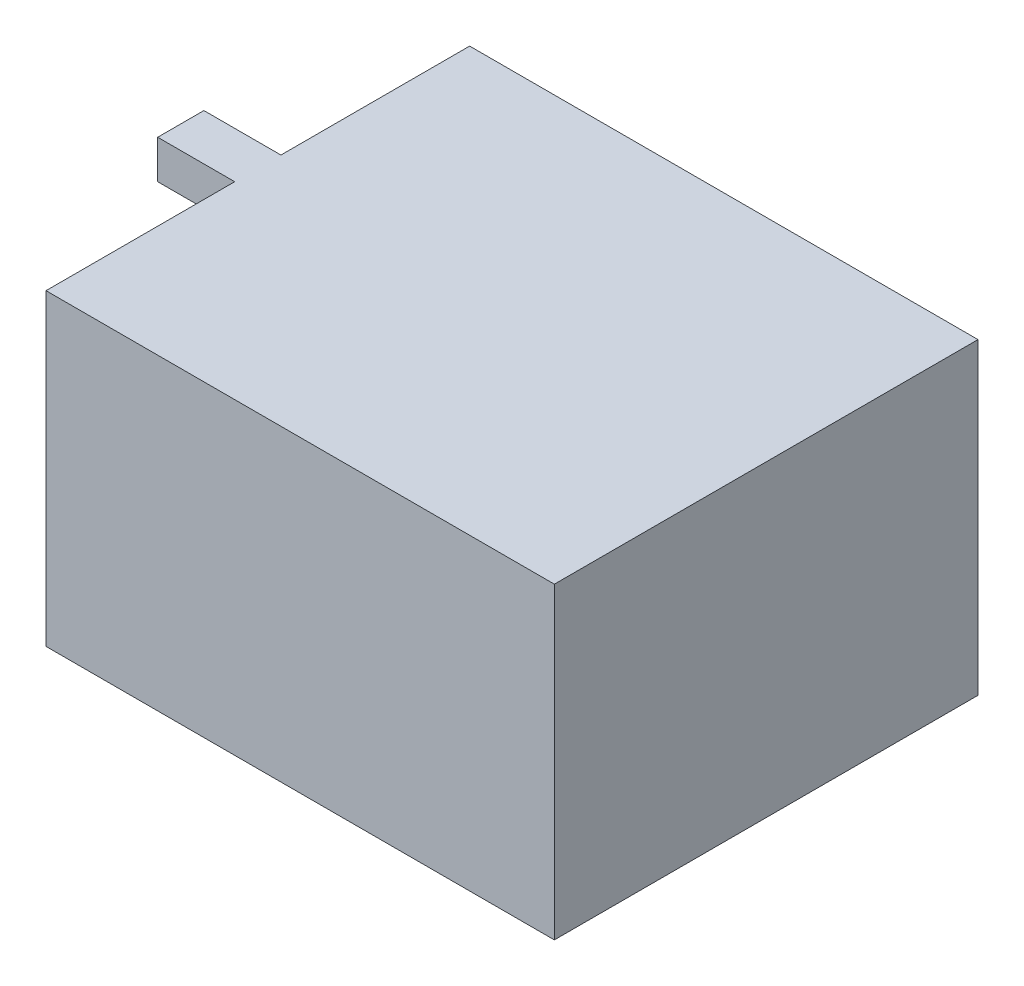
ISO-10303-21;
HEADER;
FILE_DESCRIPTION(('STEP AP214'),'2;1');
FILE_NAME('part.step','',(''),(''),'','','');
FILE_SCHEMA(('AUTOMOTIVE_DESIGN { 1 0 10303 214 1 1 1 1 }'));
ENDSEC;
DATA;
#1=APPLICATION_CONTEXT('core data for automotive mechanical design processes');
#2=APPLICATION_PROTOCOL_DEFINITION('international standard','automotive_design',2000,#1);
#3=PRODUCT_CONTEXT('',#1,'mechanical');
#4=PRODUCT('Part','Part','',(#3));
#5=PRODUCT_RELATED_PRODUCT_CATEGORY('part','',(#4));
#6=PRODUCT_DEFINITION_FORMATION('','',#4);
#7=PRODUCT_DEFINITION_CONTEXT('part definition',#1,'design');
#8=PRODUCT_DEFINITION('design','',#6,#7);
#9=PRODUCT_DEFINITION_SHAPE('','',#8);
#10=(LENGTH_UNIT() NAMED_UNIT(*) SI_UNIT(.MILLI.,.METRE.));
#11=(NAMED_UNIT(*) PLANE_ANGLE_UNIT() SI_UNIT($,.RADIAN.));
#12=(NAMED_UNIT(*) SI_UNIT($,.STERADIAN.) SOLID_ANGLE_UNIT());
#13=UNCERTAINTY_MEASURE_WITH_UNIT(LENGTH_MEASURE(1.E-05),#10,'distance_accuracy_value','');
#14=(GEOMETRIC_REPRESENTATION_CONTEXT(3) GLOBAL_UNCERTAINTY_ASSIGNED_CONTEXT((#13)) GLOBAL_UNIT_ASSIGNED_CONTEXT((#10,
#11,#12)) REPRESENTATION_CONTEXT('',''));
#15=CARTESIAN_POINT('',(0.,0.,0.));
#16=DIRECTION('',(0.,0.,1.));
#17=DIRECTION('',(1.,0.,0.));
#18=AXIS2_PLACEMENT_3D('',#15,#16,#17);
#19=CARTESIAN_POINT('',(-33.,40.,-27.5));
#20=DIRECTION('',(1.,0.,0.));
#21=DIRECTION('',(0.,0.,-1.));
#22=AXIS2_PLACEMENT_3D('',#19,#20,#21);
#23=PLANE('',#22);
#24=DIRECTION('',(0.,1.,0.));
#25=VECTOR('',#24,1.);
#26=CARTESIAN_POINT('',(-33.,35.,3.));
#27=LINE('',#26,#25);
#28=CARTESIAN_POINT('',(-33.,35.,3.));
#29=VERTEX_POINT('',#28);
#30=CARTESIAN_POINT('',(-33.,40.,3.));
#31=VERTEX_POINT('',#30);
#32=EDGE_CURVE('E54',#29,#31,#27,.T.);
#33=ORIENTED_EDGE('',*,*,#32,.F.);
#34=DIRECTION('',(0.,0.,1.));
#35=VECTOR('',#34,1.);
#36=CARTESIAN_POINT('',(-33.,35.,-3.));
#37=LINE('',#36,#35);
#38=CARTESIAN_POINT('',(-33.,35.,-3.));
#39=VERTEX_POINT('',#38);
#40=EDGE_CURVE('E123',#39,#29,#37,.T.);
#41=ORIENTED_EDGE('',*,*,#40,.F.);
#42=DIRECTION('',(0.,-1.,0.));
#43=VECTOR('',#42,1.);
#44=CARTESIAN_POINT('',(-33.,35.,-3.));
#45=LINE('',#44,#43);
#46=CARTESIAN_POINT('',(-33.,40.,-3.));
#47=VERTEX_POINT('',#46);
#48=EDGE_CURVE('E239',#47,#39,#45,.T.);
#49=ORIENTED_EDGE('',*,*,#48,.F.);
#50=DIRECTION('',(0.,0.,1.));
#51=VECTOR('',#50,1.);
#52=CARTESIAN_POINT('',(-33.,40.,-27.5));
#53=LINE('',#52,#51);
#54=CARTESIAN_POINT('',(-33.,40.,-27.5));
#55=VERTEX_POINT('',#54);
#56=EDGE_CURVE('E140',#55,#47,#53,.T.);
#57=ORIENTED_EDGE('',*,*,#56,.F.);
#58=DIRECTION('',(0.,-1.,0.));
#59=VECTOR('',#58,1.);
#60=CARTESIAN_POINT('',(-33.,40.,-27.5));
#61=LINE('',#60,#59);
#62=CARTESIAN_POINT('',(-33.,0.,-27.5));
#63=VERTEX_POINT('',#62);
#64=EDGE_CURVE('E47',#55,#63,#61,.T.);
#65=ORIENTED_EDGE('',*,*,#64,.T.);
#66=DIRECTION('',(0.,0.,1.));
#67=VECTOR('',#66,1.);
#68=CARTESIAN_POINT('',(-33.,0.,-27.5));
#69=LINE('',#68,#67);
#70=CARTESIAN_POINT('',(-33.,0.,27.5));
#71=VERTEX_POINT('',#70);
#72=EDGE_CURVE('E146',#63,#71,#69,.T.);
#73=ORIENTED_EDGE('',*,*,#72,.T.);
#74=DIRECTION('',(0.,-1.,0.));
#75=VECTOR('',#74,1.);
#76=CARTESIAN_POINT('',(-33.,40.,27.5));
#77=LINE('',#76,#75);
#78=CARTESIAN_POINT('',(-33.,40.,27.5));
#79=VERTEX_POINT('',#78);
#80=EDGE_CURVE('E151',#79,#71,#77,.T.);
#81=ORIENTED_EDGE('',*,*,#80,.F.);
#82=EDGE_CURVE('E59',#31,#79,#53,.T.);
#83=ORIENTED_EDGE('',*,*,#82,.F.);
#84=EDGE_LOOP('',(#33,#41,#49,#57,#65,#73,#81,#83));
#85=FACE_BOUND('',#84,.T.);
#86=ADVANCED_FACE('F39',(#85),#23,.F.);
#87=CARTESIAN_POINT('',(33.,40.,-27.5));
#88=DIRECTION('',(-1.,0.,0.));
#89=DIRECTION('',(0.,0.,1.));
#90=AXIS2_PLACEMENT_3D('',#87,#88,#89);
#91=PLANE('',#90);
#92=DIRECTION('',(0.,0.,-1.));
#93=VECTOR('',#92,1.);
#94=CARTESIAN_POINT('',(33.,0.,-27.5));
#95=LINE('',#94,#93);
#96=CARTESIAN_POINT('',(33.,0.,27.5));
#97=VERTEX_POINT('',#96);
#98=CARTESIAN_POINT('',(33.,0.,-27.5));
#99=VERTEX_POINT('',#98);
#100=EDGE_CURVE('E126',#97,#99,#95,.T.);
#101=ORIENTED_EDGE('',*,*,#100,.T.);
#102=DIRECTION('',(0.,-1.,0.));
#103=VECTOR('',#102,1.);
#104=CARTESIAN_POINT('',(33.,40.,-27.5));
#105=LINE('',#104,#103);
#106=CARTESIAN_POINT('',(33.,40.,-27.5));
#107=VERTEX_POINT('',#106);
#108=EDGE_CURVE('E11',#107,#99,#105,.T.);
#109=ORIENTED_EDGE('',*,*,#108,.F.);
#110=DIRECTION('',(0.,0.,-1.));
#111=VECTOR('',#110,1.);
#112=CARTESIAN_POINT('',(33.,40.,-27.5));
#113=LINE('',#112,#111);
#114=CARTESIAN_POINT('',(33.,40.,27.5));
#115=VERTEX_POINT('',#114);
#116=EDGE_CURVE('E135',#115,#107,#113,.T.);
#117=ORIENTED_EDGE('',*,*,#116,.F.);
#118=DIRECTION('',(0.,-1.,0.));
#119=VECTOR('',#118,1.);
#120=CARTESIAN_POINT('',(33.,40.,27.5));
#121=LINE('',#120,#119);
#122=EDGE_CURVE('E143',#115,#97,#121,.T.);
#123=ORIENTED_EDGE('',*,*,#122,.T.);
#124=EDGE_LOOP('',(#101,#109,#117,#123));
#125=FACE_BOUND('',#124,.T.);
#126=ADVANCED_FACE('F41',(#125),#91,.F.);
#127=CARTESIAN_POINT('',(-33.,40.,-27.5));
#128=DIRECTION('',(0.,0.,1.));
#129=DIRECTION('',(1.,0.,0.));
#130=AXIS2_PLACEMENT_3D('',#127,#128,#129);
#131=PLANE('',#130);
#132=DIRECTION('',(-1.,0.,0.));
#133=VECTOR('',#132,1.);
#134=CARTESIAN_POINT('',(-33.,0.,-27.5));
#135=LINE('',#134,#133);
#136=EDGE_CURVE('E129',#99,#63,#135,.T.);
#137=ORIENTED_EDGE('',*,*,#136,.T.);
#138=ORIENTED_EDGE('',*,*,#64,.F.);
#139=DIRECTION('',(-1.,0.,0.));
#140=VECTOR('',#139,1.);
#141=CARTESIAN_POINT('',(-33.,40.,-27.5));
#142=LINE('',#141,#140);
#143=EDGE_CURVE('E137',#107,#55,#142,.T.);
#144=ORIENTED_EDGE('',*,*,#143,.F.);
#145=ORIENTED_EDGE('',*,*,#108,.T.);
#146=EDGE_LOOP('',(#137,#138,#144,#145));
#147=FACE_BOUND('',#146,.T.);
#148=ADVANCED_FACE('F169',(#147),#131,.F.);
#149=CARTESIAN_POINT('',(-33.,40.,27.5));
#150=DIRECTION('',(0.,0.,-1.));
#151=DIRECTION('',(-1.,0.,0.));
#152=AXIS2_PLACEMENT_3D('',#149,#150,#151);
#153=PLANE('',#152);
#154=DIRECTION('',(1.,0.,0.));
#155=VECTOR('',#154,1.);
#156=CARTESIAN_POINT('',(-33.,0.,27.5));
#157=LINE('',#156,#155);
#158=EDGE_CURVE('E138',#71,#97,#157,.T.);
#159=ORIENTED_EDGE('',*,*,#158,.T.);
#160=ORIENTED_EDGE('',*,*,#122,.F.);
#161=DIRECTION('',(1.,0.,0.));
#162=VECTOR('',#161,1.);
#163=CARTESIAN_POINT('',(-33.,40.,27.5));
#164=LINE('',#163,#162);
#165=EDGE_CURVE('E142',#79,#115,#164,.T.);
#166=ORIENTED_EDGE('',*,*,#165,.F.);
#167=ORIENTED_EDGE('',*,*,#80,.T.);
#168=EDGE_LOOP('',(#159,#160,#166,#167));
#169=FACE_BOUND('',#168,.T.);
#170=ADVANCED_FACE('F164',(#169),#153,.F.);
#171=CARTESIAN_POINT('',(0.,40.,0.));
#172=DIRECTION('',(0.,1.,0.));
#173=DIRECTION('',(0.,0.,1.));
#174=AXIS2_PLACEMENT_3D('',#171,#172,#173);
#175=PLANE('',#174);
#176=ORIENTED_EDGE('',*,*,#116,.T.);
#177=ORIENTED_EDGE('',*,*,#143,.T.);
#178=ORIENTED_EDGE('',*,*,#56,.T.);
#179=DIRECTION('',(1.,0.,0.));
#180=VECTOR('',#179,1.);
#181=CARTESIAN_POINT('',(-43.,40.,-2.99999999999999));
#182=LINE('',#181,#180);
#183=CARTESIAN_POINT('',(-43.,40.,-2.99999999999999));
#184=VERTEX_POINT('',#183);
#185=EDGE_CURVE('E110',#184,#47,#182,.T.);
#186=ORIENTED_EDGE('',*,*,#185,.F.);
#187=DIRECTION('',(0.,0.,-1.));
#188=VECTOR('',#187,1.);
#189=CARTESIAN_POINT('',(-43.,40.,-2.99999999999999));
#190=LINE('',#189,#188);
#191=CARTESIAN_POINT('',(-43.,40.,3.));
#192=VERTEX_POINT('',#191);
#193=EDGE_CURVE('E102',#192,#184,#190,.T.);
#194=ORIENTED_EDGE('',*,*,#193,.F.);
#195=DIRECTION('',(1.,0.,0.));
#196=VECTOR('',#195,1.);
#197=CARTESIAN_POINT('',(-43.,40.,3.));
#198=LINE('',#197,#196);
#199=EDGE_CURVE('E107',#192,#31,#198,.T.);
#200=ORIENTED_EDGE('',*,*,#199,.T.);
#201=ORIENTED_EDGE('',*,*,#82,.T.);
#202=ORIENTED_EDGE('',*,*,#165,.T.);
#203=EDGE_LOOP('',(#176,#177,#178,#186,#194,#200,#201,#202));
#204=FACE_BOUND('',#203,.T.);
#205=ADVANCED_FACE('F105',(#204),#175,.T.);
#206=CARTESIAN_POINT('',(0.,0.,0.));
#207=DIRECTION('',(0.,1.,0.));
#208=DIRECTION('',(0.,0.,1.));
#209=AXIS2_PLACEMENT_3D('',#206,#207,#208);
#210=PLANE('',#209);
#211=ORIENTED_EDGE('',*,*,#100,.F.);
#212=ORIENTED_EDGE('',*,*,#158,.F.);
#213=ORIENTED_EDGE('',*,*,#72,.F.);
#214=ORIENTED_EDGE('',*,*,#136,.F.);
#215=EDGE_LOOP('',(#211,#212,#213,#214));
#216=FACE_BOUND('',#215,.T.);
#217=ADVANCED_FACE('F161',(#216),#210,.F.);
#218=CARTESIAN_POINT('',(-43.,35.,3.00000000000001));
#219=DIRECTION('',(0.,0.,-1.));
#220=DIRECTION('',(0.,1.,0.));
#221=AXIS2_PLACEMENT_3D('',#218,#219,#220);
#222=PLANE('',#221);
#223=ORIENTED_EDGE('',*,*,#32,.T.);
#224=ORIENTED_EDGE('',*,*,#199,.F.);
#225=DIRECTION('',(0.,1.,0.));
#226=VECTOR('',#225,1.);
#227=CARTESIAN_POINT('',(-43.,35.,3.00000000000001));
#228=LINE('',#227,#226);
#229=CARTESIAN_POINT('',(-43.,35.,3.00000000000001));
#230=VERTEX_POINT('',#229);
#231=EDGE_CURVE('E114',#230,#192,#228,.T.);
#232=ORIENTED_EDGE('',*,*,#231,.F.);
#233=DIRECTION('',(1.,0.,0.));
#234=VECTOR('',#233,1.);
#235=CARTESIAN_POINT('',(-43.,35.,3.00000000000001));
#236=LINE('',#235,#234);
#237=EDGE_CURVE('E236',#230,#29,#236,.T.);
#238=ORIENTED_EDGE('',*,*,#237,.T.);
#239=EDGE_LOOP('',(#223,#224,#232,#238));
#240=FACE_BOUND('',#239,.T.);
#241=ADVANCED_FACE('F125',(#240),#222,.F.);
#242=CARTESIAN_POINT('',(-43.,35.,-2.99999999999999));
#243=DIRECTION('',(0.,0.,1.));
#244=DIRECTION('',(0.,-1.,0.));
#245=AXIS2_PLACEMENT_3D('',#242,#243,#244);
#246=PLANE('',#245);
#247=ORIENTED_EDGE('',*,*,#48,.T.);
#248=DIRECTION('',(1.,0.,0.));
#249=VECTOR('',#248,1.);
#250=CARTESIAN_POINT('',(-43.,35.,-2.99999999999999));
#251=LINE('',#250,#249);
#252=CARTESIAN_POINT('',(-43.,35.,-2.99999999999999));
#253=VERTEX_POINT('',#252);
#254=EDGE_CURVE('E131',#253,#39,#251,.T.);
#255=ORIENTED_EDGE('',*,*,#254,.F.);
#256=DIRECTION('',(0.,-1.,0.));
#257=VECTOR('',#256,1.);
#258=CARTESIAN_POINT('',(-43.,35.,-2.99999999999999));
#259=LINE('',#258,#257);
#260=EDGE_CURVE('E113',#184,#253,#259,.T.);
#261=ORIENTED_EDGE('',*,*,#260,.F.);
#262=ORIENTED_EDGE('',*,*,#185,.T.);
#263=EDGE_LOOP('',(#247,#255,#261,#262));
#264=FACE_BOUND('',#263,.T.);
#265=ADVANCED_FACE('F187',(#264),#246,.F.);
#266=CARTESIAN_POINT('',(-43.,35.,-2.99999999999999));
#267=DIRECTION('',(0.,1.,0.));
#268=DIRECTION('',(0.,0.,1.));
#269=AXIS2_PLACEMENT_3D('',#266,#267,#268);
#270=PLANE('',#269);
#271=ORIENTED_EDGE('',*,*,#40,.T.);
#272=ORIENTED_EDGE('',*,*,#237,.F.);
#273=DIRECTION('',(0.,0.,1.));
#274=VECTOR('',#273,1.);
#275=CARTESIAN_POINT('',(-43.,35.,-2.99999999999999));
#276=LINE('',#275,#274);
#277=EDGE_CURVE('E119',#253,#230,#276,.T.);
#278=ORIENTED_EDGE('',*,*,#277,.F.);
#279=ORIENTED_EDGE('',*,*,#254,.T.);
#280=EDGE_LOOP('',(#271,#272,#278,#279));
#281=FACE_BOUND('',#280,.T.);
#282=ADVANCED_FACE('F190',(#281),#270,.F.);
#283=CARTESIAN_POINT('',(-43.,0.,0.));
#284=DIRECTION('',(1.,0.,0.));
#285=DIRECTION('',(0.,0.,-1.));
#286=AXIS2_PLACEMENT_3D('',#283,#284,#285);
#287=PLANE('',#286);
#288=ORIENTED_EDGE('',*,*,#231,.T.);
#289=ORIENTED_EDGE('',*,*,#193,.T.);
#290=ORIENTED_EDGE('',*,*,#260,.T.);
#291=ORIENTED_EDGE('',*,*,#277,.T.);
#292=EDGE_LOOP('',(#288,#289,#290,#291));
#293=FACE_BOUND('',#292,.T.);
#294=ADVANCED_FACE('F117',(#293),#287,.F.);
#295=CLOSED_SHELL('',(#86,#126,#148,#170,#205,#217,#241,#265,#282,#294));
#296=MANIFOLD_SOLID_BREP('B2',#295);
#297=ADVANCED_BREP_SHAPE_REPRESENTATION('',(#18,#296),#14);
#298=SHAPE_DEFINITION_REPRESENTATION(#9,#297);
ENDSEC;
END-ISO-10303-21;
